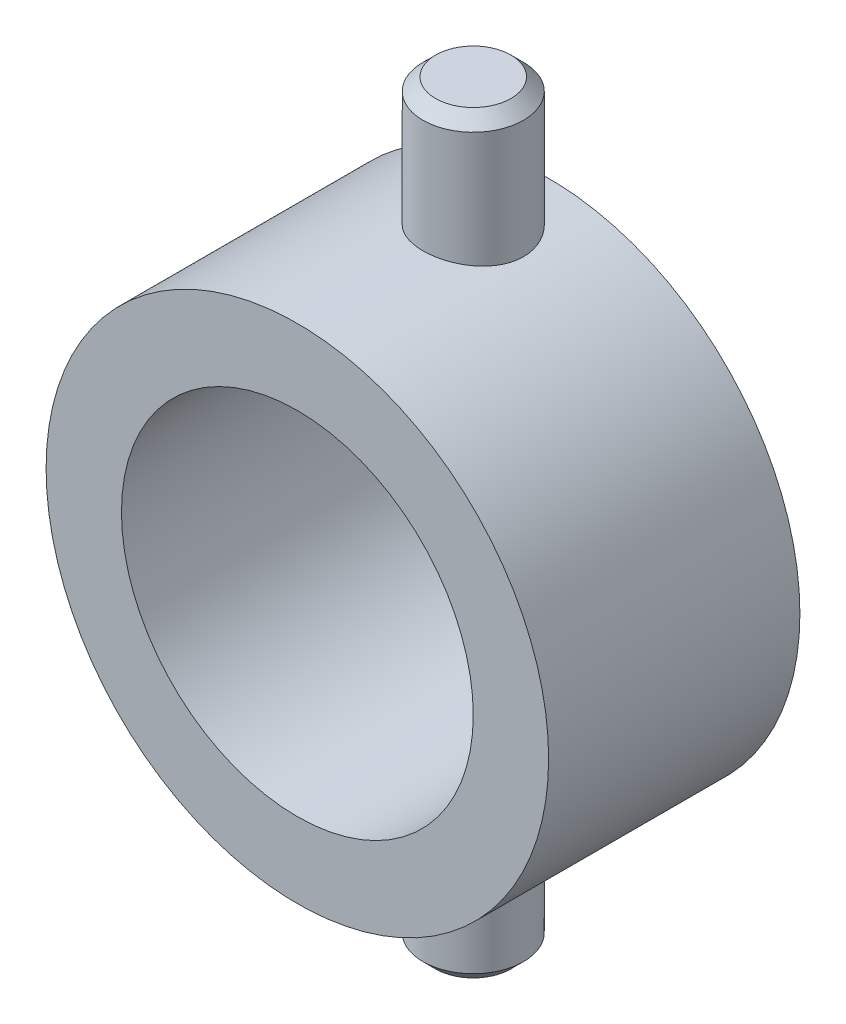
ISO-10303-21;
HEADER;
FILE_DESCRIPTION(('STEP AP214'),'2;1');
FILE_NAME('part.step','',(''),(''),'','','');
FILE_SCHEMA(('AUTOMOTIVE_DESIGN { 1 0 10303 214 1 1 1 1 }'));
ENDSEC;
DATA;
#1=APPLICATION_CONTEXT('core data for automotive mechanical design processes');
#2=APPLICATION_PROTOCOL_DEFINITION('international standard','automotive_design',2000,#1);
#3=PRODUCT_CONTEXT('',#1,'mechanical');
#4=PRODUCT('Part','Part','',(#3));
#5=PRODUCT_RELATED_PRODUCT_CATEGORY('part','',(#4));
#6=PRODUCT_DEFINITION_FORMATION('','',#4);
#7=PRODUCT_DEFINITION_CONTEXT('part definition',#1,'design');
#8=PRODUCT_DEFINITION('design','',#6,#7);
#9=PRODUCT_DEFINITION_SHAPE('','',#8);
#10=(LENGTH_UNIT() NAMED_UNIT(*) SI_UNIT(.MILLI.,.METRE.));
#11=(NAMED_UNIT(*) PLANE_ANGLE_UNIT() SI_UNIT($,.RADIAN.));
#12=(NAMED_UNIT(*) SI_UNIT($,.STERADIAN.) SOLID_ANGLE_UNIT());
#13=UNCERTAINTY_MEASURE_WITH_UNIT(LENGTH_MEASURE(1.E-05),#10,'distance_accuracy_value','');
#14=(GEOMETRIC_REPRESENTATION_CONTEXT(3) GLOBAL_UNCERTAINTY_ASSIGNED_CONTEXT((#13)) GLOBAL_UNIT_ASSIGNED_CONTEXT((#10,
#11,#12)) REPRESENTATION_CONTEXT('',''));
#15=CARTESIAN_POINT('',(0.,0.,0.));
#16=DIRECTION('',(0.,0.,1.));
#17=DIRECTION('',(1.,0.,0.));
#18=AXIS2_PLACEMENT_3D('',#15,#16,#17);
#19=CARTESIAN_POINT('',(0.,0.,10.));
#20=DIRECTION('',(0.,0.,-1.));
#21=DIRECTION('',(-1.,0.,0.));
#22=AXIS2_PLACEMENT_3D('',#19,#20,#21);
#23=CYLINDRICAL_SURFACE('',#22,10.);
#24=CARTESIAN_POINT('',(0.,10.,5.));
#25=CARTESIAN_POINT('',(0.111153813585266,9.99999795161742,4.99999591100331));
#26=CARTESIAN_POINT('',(0.222359320403045,9.99812770356462,4.99070231406471));
#27=CARTESIAN_POINT('',(0.441627015378038,9.99084731246463,4.95380299976951));
#28=CARTESIAN_POINT('',(0.549686635082711,9.98543435720372,4.92618273439698));
#29=CARTESIAN_POINT('',(0.759460610526626,9.97167298556573,4.85351745275842));
#30=CARTESIAN_POINT('',(0.861180935866268,9.96332738153436,4.80848912631062));
#31=CARTESIAN_POINT('',(1.05561597772845,9.94460796070629,4.70233550497741));
#32=CARTESIAN_POINT('',(1.14833123015162,9.93423426471414,4.64121116878559));
#33=CARTESIAN_POINT('',(1.32338695462973,9.9124433065994,4.50372301141713));
#34=CARTESIAN_POINT('',(1.40558790231705,9.90101491008695,4.4271832892176));
#35=CARTESIAN_POINT('',(1.55607351321606,9.87848360905177,4.2614151672166));
#36=CARTESIAN_POINT('',(1.62435708954085,9.86738073000848,4.17218577732976));
#37=CARTESIAN_POINT('',(1.74566350669524,9.8466488362523,3.98256761397625));
#38=CARTESIAN_POINT('',(1.79854187773173,9.83703414729892,3.88208471240728));
#39=CARTESIAN_POINT('',(1.88661133316062,9.82052536116836,3.67343636199184));
#40=CARTESIAN_POINT('',(1.92180416487448,9.81363099523923,3.56527167330731));
#41=CARTESIAN_POINT('',(1.97305059976965,9.80345610504409,3.34583127218417));
#42=CARTESIAN_POINT('',(1.98934899591755,9.80012940214375,3.23461491171555));
#43=CARTESIAN_POINT('',(2.00310425545224,9.79732750121254,3.01098035727132));
#44=CARTESIAN_POINT('',(2.000563045427,9.79785190935681,2.89856228735971));
#45=CARTESIAN_POINT('',(1.97690914620364,9.80265102296369,2.67750642395799));
#46=CARTESIAN_POINT('',(1.95607708048781,9.80686905717527,2.56883718874537));
#47=CARTESIAN_POINT('',(1.8968757692461,9.81849092320002,2.356567846674));
#48=CARTESIAN_POINT('',(1.85850568620136,9.82589490715558,2.25296798216199));
#49=CARTESIAN_POINT('',(1.76504956734944,9.84311237000816,2.0529694765928));
#50=CARTESIAN_POINT('',(1.70985230246423,9.85294179627409,1.95662424086166));
#51=CARTESIAN_POINT('',(1.58438714914536,9.87389237546124,1.77445830005437));
#52=CARTESIAN_POINT('',(1.51411752871366,9.88501367676732,1.68863880629769));
#53=CARTESIAN_POINT('',(1.35899986912117,9.90754042482924,1.52834119508613));
#54=CARTESIAN_POINT('',(1.27391232242489,9.9189473842181,1.45409486428174));
#55=CARTESIAN_POINT('',(1.09237004812402,9.94057697428817,1.32089230739755));
#56=CARTESIAN_POINT('',(0.995915174758779,9.95079958977947,1.26193627741284));
#57=CARTESIAN_POINT('',(0.794118773757842,9.96893380321774,1.16094498154805));
#58=CARTESIAN_POINT('',(0.6887636391706,9.97684177696544,1.11893621271093));
#59=CARTESIAN_POINT('',(0.47229795289733,9.98942817975716,1.05327905192287));
#60=CARTESIAN_POINT('',(0.361188100144899,9.99410700001063,1.02962843585274));
#61=CARTESIAN_POINT('',(0.138358811254301,9.99965343733735,1.00168709241145));
#62=CARTESIAN_POINT('',(0.0266806566511529,10.0005834930494,0.997079160919463));
#63=CARTESIAN_POINT('',(-0.195849868385428,9.99870103860205,1.00649971788436));
#64=CARTESIAN_POINT('',(-0.306702284887586,9.99588873882892,1.02052715870519));
#65=CARTESIAN_POINT('',(-0.523411319893081,9.98687664016035,1.06655674708791));
#66=CARTESIAN_POINT('',(-0.629303896679805,9.98070752808413,1.09839613699581));
#67=CARTESIAN_POINT('',(-0.834247254999334,9.96567104122065,1.17896796531162));
#68=CARTESIAN_POINT('',(-0.933297523275078,9.95680346428454,1.22770166935366));
#69=CARTESIAN_POINT('',(-1.12308234737243,9.93719823066589,1.34136498130262));
#70=CARTESIAN_POINT('',(-1.21370025350438,9.92643900874104,1.40648556207789));
#71=CARTESIAN_POINT('',(-1.38283603823841,9.90429469659765,1.55081838241456));
#72=CARTESIAN_POINT('',(-1.46135261786152,9.89290953936776,1.63003213279973));
#73=CARTESIAN_POINT('',(-1.60528118154835,9.8705860711393,1.80174670378225));
#74=CARTESIAN_POINT('',(-1.67047540489731,9.85965720466609,1.89443148844267));
#75=CARTESIAN_POINT('',(-1.78437084010241,9.83968383592389,2.08962272271336));
#76=CARTESIAN_POINT('',(-1.83307271184581,9.83063925826685,2.19212877914711));
#77=CARTESIAN_POINT('',(-1.91230368316392,9.81553481168766,2.4035364922991));
#78=CARTESIAN_POINT('',(-1.9429269995821,9.80945949744373,2.51240168242064));
#79=CARTESIAN_POINT('',(-1.98541730325439,9.8009487358405,2.73386690698181));
#80=CARTESIAN_POINT('',(-1.99728673645022,9.79851281382223,2.84646645241869));
#81=CARTESIAN_POINT('',(-2.00184182173494,9.79758299262758,3.07001772908864));
#82=CARTESIAN_POINT('',(-1.99487157614179,9.79901838378602,3.18096229785402));
#83=CARTESIAN_POINT('',(-1.96270460820012,9.80551146969228,3.40006329981005));
#84=CARTESIAN_POINT('',(-1.9375080322586,9.81056913534338,3.50821975538961));
#85=CARTESIAN_POINT('',(-1.86975713699791,9.82370528438317,3.71845542248109));
#86=CARTESIAN_POINT('',(-1.82724501343469,9.83177642037661,3.82054872100483));
#87=CARTESIAN_POINT('',(-1.72610928920321,9.85003429948341,4.01620744146888));
#88=CARTESIAN_POINT('',(-1.66748433754976,9.86022121997788,4.10977214745028));
#89=CARTESIAN_POINT('',(-1.53461182957283,9.88177921046451,4.28743114430063));
#90=CARTESIAN_POINT('',(-1.46011577447036,9.89316745819399,4.37133753053519));
#91=CARTESIAN_POINT('',(-1.29812873802628,9.91572163743909,4.52557241105834));
#92=CARTESIAN_POINT('',(-1.21063477430667,9.92688751726369,4.59589778063454));
#93=CARTESIAN_POINT('',(-1.02403525817649,9.94787664775943,4.72166928789289));
#94=CARTESIAN_POINT('',(-0.92481776885967,9.95768462438492,4.77695200656005));
#95=CARTESIAN_POINT('',(-0.718332721881466,9.9747025017,4.86997224519318));
#96=CARTESIAN_POINT('',(-0.611072521726253,9.98191474277232,4.90772557906498));
#97=CARTESIAN_POINT('',(-0.41964297784756,9.99152745190741,4.95730389608943));
#98=CARTESIAN_POINT('',(-0.33656332802757,9.99468606316904,4.97328638741551));
#99=CARTESIAN_POINT('',(-0.168999050420135,9.99892308279786,4.99463582471673));
#100=CARTESIAN_POINT('',(-0.0845144674972385,10.0000015574631,5.00000310901954));
#101=CARTESIAN_POINT('',(0.,10.,5.));
#102=B_SPLINE_CURVE_WITH_KNOTS('',3,(#24,#25,#26,#27,#28,#29,#30,#31,#32,#33,#34,#35,#36,#37,
#38,#39,#40,#41,#42,#43,#44,#45,#46,#47,#48,#49,#50,#51,#52,#53,#54,#55,#56,#57,#58,#59,#60,#61,
#62,#63,#64,#65,#66,#67,#68,#69,#70,#71,#72,#73,#74,#75,#76,#77,#78,#79,#80,#81,#82,#83,#84,#85,
#86,#87,#88,#89,#90,#91,#92,#93,#94,#95,#96,#97,#98,#99,#100,#101),.UNSPECIFIED.,.T.,.F.,(4,2,2,
2,2,2,2,2,2,2,2,2,2,2,2,2,2,2,2,2,2,2,2,2,2,2,2,2,2,2,2,2,2,2,2,2,2,2,4),(0.,0.333152261322517,
0.666569301382646,0.999667470500683,1.33274580446173,1.66986534022437,2.00701119349473,
2.34722390011845,2.68740298730395,3.02312370207175,3.3588100856245,3.68943454012556,
4.02007478507459,4.35294980407185,4.68586309499341,5.02476504982701,5.3636713507964,
5.70310549708048,6.04249851396072,6.3762147135253,6.70991215315735,7.04060907901447,
7.37133078432045,7.70610132066717,8.0409077669186,8.38081257158451,8.72070377446933,
9.05880762065446,9.39686736660829,9.72879445135402,10.0607188698522,10.3918392250622,
10.7229873516373,11.0597615247829,11.3966130906586,11.7369899335127,12.0770591103504,
12.3303755057979,12.5836838274199),.UNSPECIFIED.);
#103=CARTESIAN_POINT('',(0.,10.,5.));
#104=VERTEX_POINT('',#103);
#105=EDGE_CURVE('E80',#104,#104,#102,.T.);
#106=ORIENTED_EDGE('',*,*,#105,.F.);
#107=EDGE_LOOP('',(#106));
#108=FACE_BOUND('',#107,.T.);
#109=CARTESIAN_POINT('',(0.,0.,10.));
#110=DIRECTION('',(0.,0.,1.));
#111=DIRECTION('',(1.,0.,0.));
#112=AXIS2_PLACEMENT_3D('',#109,#110,#111);
#113=CIRCLE('',#112,10.);
#114=CARTESIAN_POINT('',(10.,0.,10.));
#115=VERTEX_POINT('',#114);
#116=EDGE_CURVE('E62',#115,#115,#113,.T.);
#117=ORIENTED_EDGE('',*,*,#116,.F.);
#118=EDGE_LOOP('',(#117));
#119=FACE_BOUND('',#118,.T.);
#120=CARTESIAN_POINT('',(0.,0.,0.));
#121=DIRECTION('',(0.,0.,1.));
#122=DIRECTION('',(1.,0.,0.));
#123=AXIS2_PLACEMENT_3D('',#120,#121,#122);
#124=CIRCLE('',#123,10.);
#125=CARTESIAN_POINT('',(10.,0.,0.));
#126=VERTEX_POINT('',#125);
#127=EDGE_CURVE('E63',#126,#126,#124,.T.);
#128=ORIENTED_EDGE('',*,*,#127,.T.);
#129=EDGE_LOOP('',(#128));
#130=FACE_BOUND('',#129,.T.);
#131=CARTESIAN_POINT('',(0.,-10.,1.));
#132=CARTESIAN_POINT('',(0.111153813585266,-9.99999795161742,1.00000408899669));
#133=CARTESIAN_POINT('',(0.222359320403045,-9.99812770356462,1.00929768593529));
#134=CARTESIAN_POINT('',(0.441627015378038,-9.99084731246463,1.04619700023049));
#135=CARTESIAN_POINT('',(0.549686635082711,-9.98543435720372,1.07381726560302));
#136=CARTESIAN_POINT('',(0.759460610526625,-9.97167298556573,1.14648254724158));
#137=CARTESIAN_POINT('',(0.861180935866268,-9.96332738153436,1.19151087368938));
#138=CARTESIAN_POINT('',(1.05561597772845,-9.94460796070629,1.29766449502259));
#139=CARTESIAN_POINT('',(1.14833123015162,-9.93423426471414,1.35878883121441));
#140=CARTESIAN_POINT('',(1.32338695462973,-9.9124433065994,1.49627698858287));
#141=CARTESIAN_POINT('',(1.40558790231705,-9.90101491008695,1.5728167107824));
#142=CARTESIAN_POINT('',(1.55607351321606,-9.87848360905177,1.7385848327834));
#143=CARTESIAN_POINT('',(1.62435708954085,-9.86738073000848,1.82781422267024));
#144=CARTESIAN_POINT('',(1.74566350669524,-9.8466488362523,2.01743238602375));
#145=CARTESIAN_POINT('',(1.79854187773173,-9.83703414729892,2.11791528759272));
#146=CARTESIAN_POINT('',(1.88661133316062,-9.82052536116836,2.32656363800816));
#147=CARTESIAN_POINT('',(1.92180416487448,-9.81363099523923,2.43472832669269));
#148=CARTESIAN_POINT('',(1.97305059976965,-9.80345610504409,2.65416872781583));
#149=CARTESIAN_POINT('',(1.98934899591755,-9.80012940214375,2.76538508828445));
#150=CARTESIAN_POINT('',(2.00310425545224,-9.79732750121254,2.98901964272868));
#151=CARTESIAN_POINT('',(2.000563045427,-9.79785190935681,3.10143771264029));
#152=CARTESIAN_POINT('',(1.97690914620364,-9.80265102296369,3.32249357604201));
#153=CARTESIAN_POINT('',(1.95607708048781,-9.80686905717527,3.43116281125463));
#154=CARTESIAN_POINT('',(1.8968757692461,-9.81849092320002,3.643432153326));
#155=CARTESIAN_POINT('',(1.85850568620136,-9.82589490715558,3.74703201783802));
#156=CARTESIAN_POINT('',(1.76504956734944,-9.84311237000816,3.9470305234072));
#157=CARTESIAN_POINT('',(1.70985230246423,-9.85294179627409,4.04337575913834));
#158=CARTESIAN_POINT('',(1.58438714914536,-9.87389237546124,4.22554169994563));
#159=CARTESIAN_POINT('',(1.51411752871366,-9.88501367676732,4.31136119370231));
#160=CARTESIAN_POINT('',(1.35899986912117,-9.90754042482924,4.47165880491387));
#161=CARTESIAN_POINT('',(1.27391232242489,-9.9189473842181,4.54590513571826));
#162=CARTESIAN_POINT('',(1.09237004812402,-9.94057697428817,4.67910769260245));
#163=CARTESIAN_POINT('',(0.995915174758779,-9.95079958977947,4.73806372258716));
#164=CARTESIAN_POINT('',(0.794118773757842,-9.96893380321774,4.83905501845195));
#165=CARTESIAN_POINT('',(0.6887636391706,-9.97684177696544,4.88106378728907));
#166=CARTESIAN_POINT('',(0.47229795289733,-9.98942817975716,4.94672094807713));
#167=CARTESIAN_POINT('',(0.361188100144899,-9.99410700001063,4.97037156414726));
#168=CARTESIAN_POINT('',(0.138358811254301,-9.99965343733736,4.99831290758855));
#169=CARTESIAN_POINT('',(0.0266806566511523,-10.0005834930494,5.00292083908054));
#170=CARTESIAN_POINT('',(-0.195849868385428,-9.99870103860205,4.99350028211564));
#171=CARTESIAN_POINT('',(-0.306702284887586,-9.99588873882892,4.97947284129481));
#172=CARTESIAN_POINT('',(-0.523411319893082,-9.98687664016035,4.93344325291209));
#173=CARTESIAN_POINT('',(-0.629303896679806,-9.98070752808413,4.90160386300419));
#174=CARTESIAN_POINT('',(-0.834247254999335,-9.96567104122065,4.82103203468838));
#175=CARTESIAN_POINT('',(-0.933297523275079,-9.95680346428453,4.77229833064634));
#176=CARTESIAN_POINT('',(-1.12308234737244,-9.93719823066589,4.65863501869737));
#177=CARTESIAN_POINT('',(-1.21370025350438,-9.92643900874104,4.59351443792211));
#178=CARTESIAN_POINT('',(-1.38283603823841,-9.90429469659765,4.44918161758544));
#179=CARTESIAN_POINT('',(-1.46135261786152,-9.89290953936776,4.36996786720027));
#180=CARTESIAN_POINT('',(-1.60528118154835,-9.8705860711393,4.19825329621775));
#181=CARTESIAN_POINT('',(-1.67047540489731,-9.85965720466609,4.10556851155733));
#182=CARTESIAN_POINT('',(-1.78437084010241,-9.83968383592389,3.91037727728664));
#183=CARTESIAN_POINT('',(-1.83307271184581,-9.83063925826685,3.8078712208529));
#184=CARTESIAN_POINT('',(-1.91230368316392,-9.81553481168766,3.5964635077009));
#185=CARTESIAN_POINT('',(-1.9429269995821,-9.80945949744373,3.48759831757936));
#186=CARTESIAN_POINT('',(-1.98541730325439,-9.8009487358405,3.26613309301819));
#187=CARTESIAN_POINT('',(-1.99728673645022,-9.79851281382223,3.15353354758131));
#188=CARTESIAN_POINT('',(-2.00184182173494,-9.79758299262758,2.92998227091136));
#189=CARTESIAN_POINT('',(-1.99487157614179,-9.79901838378602,2.81903770214598));
#190=CARTESIAN_POINT('',(-1.96270460820012,-9.80551146969228,2.59993670018995));
#191=CARTESIAN_POINT('',(-1.9375080322586,-9.81056913534338,2.49178024461039));
#192=CARTESIAN_POINT('',(-1.86975713699791,-9.82370528438317,2.28154457751891));
#193=CARTESIAN_POINT('',(-1.82724501343469,-9.83177642037661,2.17945127899517));
#194=CARTESIAN_POINT('',(-1.72610928920321,-9.85003429948341,1.98379255853112));
#195=CARTESIAN_POINT('',(-1.66748433754976,-9.86022121997788,1.89022785254973));
#196=CARTESIAN_POINT('',(-1.53461182957283,-9.88177921046451,1.71256885569937));
#197=CARTESIAN_POINT('',(-1.46011577447036,-9.89316745819399,1.62866246946481));
#198=CARTESIAN_POINT('',(-1.29812873802628,-9.91572163743909,1.47442758894166));
#199=CARTESIAN_POINT('',(-1.21063477430667,-9.92688751726369,1.40410221936546));
#200=CARTESIAN_POINT('',(-1.02403525817649,-9.94787664775943,1.27833071210711));
#201=CARTESIAN_POINT('',(-0.92481776885967,-9.95768462438492,1.22304799343995));
#202=CARTESIAN_POINT('',(-0.718332721881465,-9.9747025017,1.13002775480682));
#203=CARTESIAN_POINT('',(-0.611072521726252,-9.98191474277232,1.09227442093502));
#204=CARTESIAN_POINT('',(-0.419642977847559,-9.99152745190741,1.04269610391057));
#205=CARTESIAN_POINT('',(-0.336563328027569,-9.99468606316904,1.02671361258448));
#206=CARTESIAN_POINT('',(-0.168999050420134,-9.99892308279786,1.00536417528327));
#207=CARTESIAN_POINT('',(-0.084514467497238,-10.0000015574631,0.999996890980464));
#208=CARTESIAN_POINT('',(0.,-10.,1.));
#209=B_SPLINE_CURVE_WITH_KNOTS('',3,(#131,#132,#133,#134,#135,#136,#137,#138,#139,#140,#141,
#142,#143,#144,#145,#146,#147,#148,#149,#150,#151,#152,#153,#154,#155,#156,#157,#158,#159,#160,
#161,#162,#163,#164,#165,#166,#167,#168,#169,#170,#171,#172,#173,#174,#175,#176,#177,#178,#179,
#180,#181,#182,#183,#184,#185,#186,#187,#188,#189,#190,#191,#192,#193,#194,#195,#196,#197,#198,
#199,#200,#201,#202,#203,#204,#205,#206,#207,#208),.UNSPECIFIED.,.T.,.F.,(4,2,2,2,2,2,2,2,2,2,2,
2,2,2,2,2,2,2,2,2,2,2,2,2,2,2,2,2,2,2,2,2,2,2,2,2,2,2,4),(0.,0.333152261322517,
0.666569301382646,0.999667470500682,1.33274580446173,1.66986534022437,2.00701119349473,
2.34722390011845,2.68740298730395,3.02312370207175,3.3588100856245,3.68943454012557,
4.02007478507459,4.35294980407185,4.68586309499341,5.02476504982701,5.3636713507964,
5.70310549708048,6.04249851396072,6.3762147135253,6.70991215315735,7.04060907901447,
7.37133078432045,7.70610132066717,8.0409077669186,8.38081257158451,8.72070377446933,
9.05880762065446,9.3968673666083,9.72879445135403,10.0607188698522,10.3918392250622,
10.7229873516373,11.0597615247829,11.3966130906586,11.7369899335127,12.0770591103504,
12.3303755057979,12.5836838274199),.UNSPECIFIED.);
#210=CARTESIAN_POINT('',(0.,-10.,1.));
#211=VERTEX_POINT('',#210);
#212=EDGE_CURVE('E54',#211,#211,#209,.T.);
#213=ORIENTED_EDGE('',*,*,#212,.F.);
#214=EDGE_LOOP('',(#213));
#215=FACE_BOUND('',#214,.T.);
#216=ADVANCED_FACE('F34',(#108,#119,#130,#215),#23,.T.);
#217=CARTESIAN_POINT('',(0.,0.,10.));
#218=DIRECTION('',(0.,0.,1.));
#219=DIRECTION('',(1.,0.,0.));
#220=AXIS2_PLACEMENT_3D('',#217,#218,#219);
#221=PLANE('',#220);
#222=CARTESIAN_POINT('',(0.,0.,10.));
#223=DIRECTION('',(0.,0.,-1.));
#224=DIRECTION('',(-1.,0.,0.));
#225=AXIS2_PLACEMENT_3D('',#222,#223,#224);
#226=CIRCLE('',#225,7.);
#227=CARTESIAN_POINT('',(-7.,0.,10.));
#228=VERTEX_POINT('',#227);
#229=EDGE_CURVE('E87',#228,#228,#226,.T.);
#230=ORIENTED_EDGE('',*,*,#229,.T.);
#231=EDGE_LOOP('',(#230));
#232=FACE_BOUND('',#231,.T.);
#233=ORIENTED_EDGE('',*,*,#116,.T.);
#234=EDGE_LOOP('',(#233));
#235=FACE_BOUND('',#234,.T.);
#236=ADVANCED_FACE('F98',(#232,#235),#221,.T.);
#237=CARTESIAN_POINT('',(0.,0.,0.));
#238=DIRECTION('',(0.,0.,1.));
#239=DIRECTION('',(1.,0.,0.));
#240=AXIS2_PLACEMENT_3D('',#237,#238,#239);
#241=PLANE('',#240);
#242=CARTESIAN_POINT('',(0.,0.,0.));
#243=DIRECTION('',(0.,0.,-1.));
#244=DIRECTION('',(-1.,0.,0.));
#245=AXIS2_PLACEMENT_3D('',#242,#243,#244);
#246=CIRCLE('',#245,7.);
#247=CARTESIAN_POINT('',(-7.,0.,0.));
#248=VERTEX_POINT('',#247);
#249=EDGE_CURVE('E86',#248,#248,#246,.T.);
#250=ORIENTED_EDGE('',*,*,#249,.F.);
#251=EDGE_LOOP('',(#250));
#252=FACE_BOUND('',#251,.T.);
#253=ORIENTED_EDGE('',*,*,#127,.F.);
#254=EDGE_LOOP('',(#253));
#255=FACE_BOUND('',#254,.T.);
#256=ADVANCED_FACE('F96',(#252,#255),#241,.F.);
#257=CARTESIAN_POINT('',(0.,0.,10.));
#258=DIRECTION('',(0.,0.,-1.));
#259=DIRECTION('',(-1.,0.,0.));
#260=AXIS2_PLACEMENT_3D('',#257,#258,#259);
#261=CYLINDRICAL_SURFACE('',#260,7.);
#262=ORIENTED_EDGE('',*,*,#229,.F.);
#263=EDGE_LOOP('',(#262));
#264=FACE_BOUND('',#263,.T.);
#265=ORIENTED_EDGE('',*,*,#249,.T.);
#266=EDGE_LOOP('',(#265));
#267=FACE_BOUND('',#266,.T.);
#268=ADVANCED_FACE('F93',(#264,#267),#261,.F.);
#269=CARTESIAN_POINT('',(0.,15.,3.));
#270=DIRECTION('',(0.,1.,0.));
#271=DIRECTION('',(0.,0.,1.));
#272=AXIS2_PLACEMENT_3D('',#269,#270,#271);
#273=PLANE('',#272);
#274=CARTESIAN_POINT('',(0.,15.,3.));
#275=DIRECTION('',(0.,1.,0.));
#276=DIRECTION('',(0.,0.,1.));
#277=AXIS2_PLACEMENT_3D('',#274,#275,#276);
#278=CIRCLE('',#277,1.49999999999999);
#279=CARTESIAN_POINT('',(0.,15.,4.49999999999999));
#280=VERTEX_POINT('',#279);
#281=EDGE_CURVE('E41',#280,#280,#278,.T.);
#282=ORIENTED_EDGE('',*,*,#281,.T.);
#283=EDGE_LOOP('',(#282));
#284=FACE_BOUND('',#283,.T.);
#285=ADVANCED_FACE('F77',(#284),#273,.T.);
#286=CARTESIAN_POINT('',(0.,-10.001,3.));
#287=DIRECTION('',(0.,1.,0.));
#288=DIRECTION('',(0.,0.,1.));
#289=AXIS2_PLACEMENT_3D('',#286,#287,#288);
#290=CYLINDRICAL_SURFACE('',#289,2.);
#291=CARTESIAN_POINT('',(0.,14.5,3.));
#292=DIRECTION('',(0.,1.,0.));
#293=DIRECTION('',(0.,0.,1.));
#294=AXIS2_PLACEMENT_3D('',#291,#292,#293);
#295=CIRCLE('',#294,2.);
#296=CARTESIAN_POINT('',(0.,14.5,5.));
#297=VERTEX_POINT('',#296);
#298=EDGE_CURVE('E10',#297,#297,#295,.F.);
#299=ORIENTED_EDGE('',*,*,#298,.T.);
#300=EDGE_LOOP('',(#299));
#301=FACE_BOUND('',#300,.T.);
#302=ORIENTED_EDGE('',*,*,#105,.T.);
#303=EDGE_LOOP('',(#302));
#304=FACE_BOUND('',#303,.T.);
#305=ADVANCED_FACE('F89',(#301,#304),#290,.T.);
#306=CARTESIAN_POINT('',(0.,-15.,3.));
#307=DIRECTION('',(0.,-1.,0.));
#308=DIRECTION('',(0.,0.,1.));
#309=AXIS2_PLACEMENT_3D('',#306,#307,#308);
#310=PLANE('',#309);
#311=CARTESIAN_POINT('',(0.,-15.,3.));
#312=DIRECTION('',(0.,-1.,0.));
#313=DIRECTION('',(0.,0.,-1.));
#314=AXIS2_PLACEMENT_3D('',#311,#312,#313);
#315=CIRCLE('',#314,1.5);
#316=CARTESIAN_POINT('',(0.,-15.,1.5));
#317=VERTEX_POINT('',#316);
#318=EDGE_CURVE('E45',#317,#317,#315,.T.);
#319=ORIENTED_EDGE('',*,*,#318,.T.);
#320=EDGE_LOOP('',(#319));
#321=FACE_BOUND('',#320,.T.);
#322=ADVANCED_FACE('F73',(#321),#310,.T.);
#323=CARTESIAN_POINT('',(0.,15.001,3.));
#324=DIRECTION('',(0.,-1.,0.));
#325=DIRECTION('',(0.,0.,-1.));
#326=AXIS2_PLACEMENT_3D('',#323,#324,#325);
#327=CYLINDRICAL_SURFACE('',#326,2.);
#328=CARTESIAN_POINT('',(0.,-14.5,3.));
#329=DIRECTION('',(0.,-1.,0.));
#330=DIRECTION('',(0.,0.,-1.));
#331=AXIS2_PLACEMENT_3D('',#328,#329,#330);
#332=CIRCLE('',#331,2.);
#333=CARTESIAN_POINT('',(0.,-14.5,1.));
#334=VERTEX_POINT('',#333);
#335=EDGE_CURVE('E49',#334,#334,#332,.F.);
#336=ORIENTED_EDGE('',*,*,#335,.T.);
#337=EDGE_LOOP('',(#336));
#338=FACE_BOUND('',#337,.T.);
#339=ORIENTED_EDGE('',*,*,#212,.T.);
#340=EDGE_LOOP('',(#339));
#341=FACE_BOUND('',#340,.T.);
#342=ADVANCED_FACE('F67',(#338,#341),#327,.T.);
#343=CARTESIAN_POINT('',(0.,-14.5,3.));
#344=DIRECTION('',(0.,1.,0.));
#345=DIRECTION('',(0.,0.,1.));
#346=AXIS2_PLACEMENT_3D('',#343,#344,#345);
#347=CONICAL_SURFACE('',#346,2.,0.78539816339745);
#348=ORIENTED_EDGE('',*,*,#318,.F.);
#349=EDGE_LOOP('',(#348));
#350=FACE_BOUND('',#349,.T.);
#351=ORIENTED_EDGE('',*,*,#335,.F.);
#352=EDGE_LOOP('',(#351));
#353=FACE_BOUND('',#352,.T.);
#354=ADVANCED_FACE('F72',(#350,#353),#347,.T.);
#355=CARTESIAN_POINT('',(0.,15.,3.));
#356=DIRECTION('',(0.,-1.,0.));
#357=DIRECTION('',(0.,0.,-1.));
#358=AXIS2_PLACEMENT_3D('',#355,#356,#357);
#359=CONICAL_SURFACE('',#358,1.49999999999999,0.78539816339745);
#360=ORIENTED_EDGE('',*,*,#298,.F.);
#361=EDGE_LOOP('',(#360));
#362=FACE_BOUND('',#361,.T.);
#363=ORIENTED_EDGE('',*,*,#281,.F.);
#364=EDGE_LOOP('',(#363));
#365=FACE_BOUND('',#364,.T.);
#366=ADVANCED_FACE('F36',(#362,#365),#359,.T.);
#367=CLOSED_SHELL('',(#216,#236,#256,#268,#285,#305,#322,#342,#354,#366));
#368=MANIFOLD_SOLID_BREP('B2',#367);
#369=ADVANCED_BREP_SHAPE_REPRESENTATION('',(#18,#368),#14);
#370=SHAPE_DEFINITION_REPRESENTATION(#9,#369);
ENDSEC;
END-ISO-10303-21;
